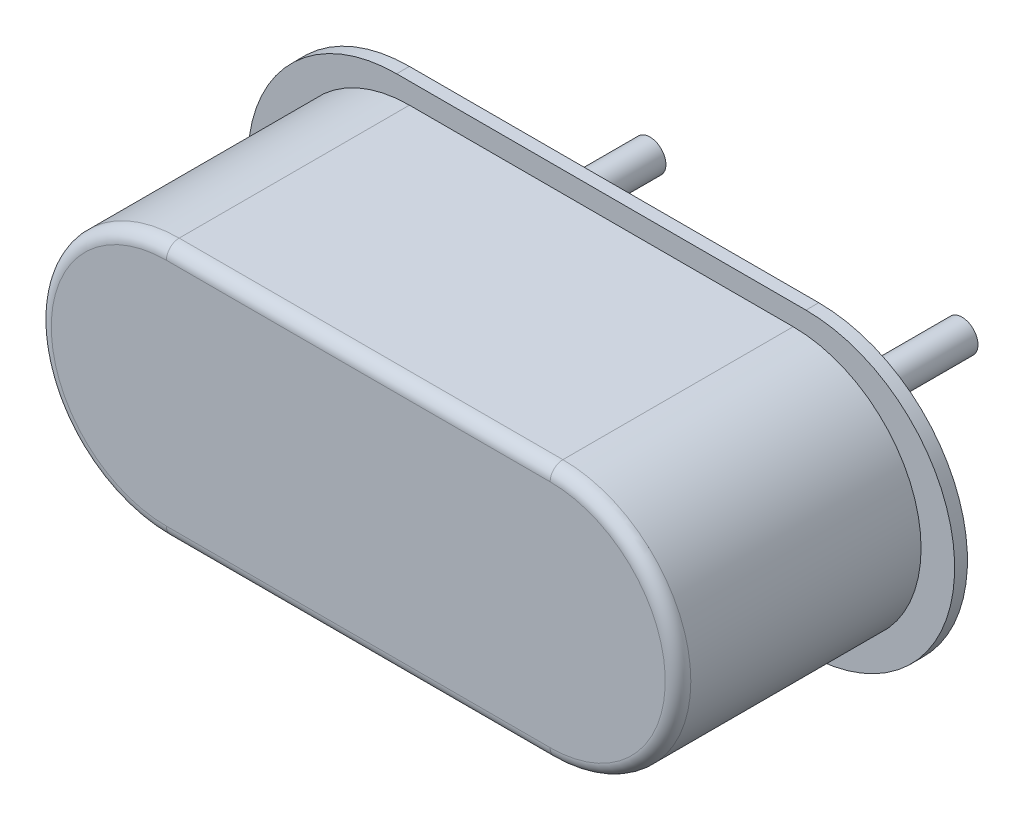
ISO-10303-21;
HEADER;
FILE_DESCRIPTION(('STEP AP214'),'2;1');
FILE_NAME('part.step','',(''),(''),'','','');
FILE_SCHEMA(('AUTOMOTIVE_DESIGN { 1 0 10303 214 1 1 1 1 }'));
ENDSEC;
DATA;
#1=APPLICATION_CONTEXT('core data for automotive mechanical design processes');
#2=APPLICATION_PROTOCOL_DEFINITION('international standard','automotive_design',2000,#1);
#3=PRODUCT_CONTEXT('',#1,'mechanical');
#4=PRODUCT('Part','Part','',(#3));
#5=PRODUCT_RELATED_PRODUCT_CATEGORY('part','',(#4));
#6=PRODUCT_DEFINITION_FORMATION('','',#4);
#7=PRODUCT_DEFINITION_CONTEXT('part definition',#1,'design');
#8=PRODUCT_DEFINITION('design','',#6,#7);
#9=PRODUCT_DEFINITION_SHAPE('','',#8);
#10=(LENGTH_UNIT() NAMED_UNIT(*) SI_UNIT(.MILLI.,.METRE.));
#11=(NAMED_UNIT(*) PLANE_ANGLE_UNIT() SI_UNIT($,.RADIAN.));
#12=(NAMED_UNIT(*) SI_UNIT($,.STERADIAN.) SOLID_ANGLE_UNIT());
#13=UNCERTAINTY_MEASURE_WITH_UNIT(LENGTH_MEASURE(1.E-05),#10,'distance_accuracy_value','');
#14=(GEOMETRIC_REPRESENTATION_CONTEXT(3) GLOBAL_UNCERTAINTY_ASSIGNED_CONTEXT((#13)) GLOBAL_UNIT_ASSIGNED_CONTEXT((#10,
#11,#12)) REPRESENTATION_CONTEXT('',''));
#15=CARTESIAN_POINT('',(0.,0.,0.));
#16=DIRECTION('',(0.,0.,1.));
#17=DIRECTION('',(1.,0.,0.));
#18=AXIS2_PLACEMENT_3D('',#15,#16,#17);
#19=CARTESIAN_POINT('',(-0.56,2.,4.1));
#20=DIRECTION('',(0.,0.,1.));
#21=DIRECTION('',(1.,0.,0.));
#22=AXIS2_PLACEMENT_3D('',#19,#20,#21);
#23=PLANE('',#22);
#24=DIRECTION('',(1.,0.,0.));
#25=VECTOR('',#24,1.);
#26=CARTESIAN_POINT('',(-0.56,1.8,4.1));
#27=LINE('',#26,#25);
#28=CARTESIAN_POINT('',(-0.56,1.8,4.1));
#29=VERTEX_POINT('',#28);
#30=CARTESIAN_POINT('',(5.44,1.8,4.1));
#31=VERTEX_POINT('',#30);
#32=EDGE_CURVE('E27',#29,#31,#27,.T.);
#33=ORIENTED_EDGE('',*,*,#32,.F.);
#34=CARTESIAN_POINT('',(-0.56,0.,4.1));
#35=DIRECTION('',(0.,0.,-1.));
#36=DIRECTION('',(-1.,0.,0.));
#37=AXIS2_PLACEMENT_3D('',#34,#35,#36);
#38=CIRCLE('',#37,1.8);
#39=CARTESIAN_POINT('',(-0.56,-1.8,4.1));
#40=VERTEX_POINT('',#39);
#41=EDGE_CURVE('E11',#40,#29,#38,.T.);
#42=ORIENTED_EDGE('',*,*,#41,.F.);
#43=DIRECTION('',(-1.,0.,0.));
#44=VECTOR('',#43,1.);
#45=CARTESIAN_POINT('',(5.44,-1.8,4.1));
#46=LINE('',#45,#44);
#47=CARTESIAN_POINT('',(5.44,-1.8,4.1));
#48=VERTEX_POINT('',#47);
#49=EDGE_CURVE('E58',#48,#40,#46,.T.);
#50=ORIENTED_EDGE('',*,*,#49,.F.);
#51=CARTESIAN_POINT('',(5.44,0.,4.1));
#52=DIRECTION('',(0.,0.,-1.));
#53=DIRECTION('',(1.,0.,0.));
#54=AXIS2_PLACEMENT_3D('',#51,#52,#53);
#55=CIRCLE('',#54,1.8);
#56=EDGE_CURVE('E72',#31,#48,#55,.T.);
#57=ORIENTED_EDGE('',*,*,#56,.F.);
#58=EDGE_LOOP('',(#33,#42,#50,#57));
#59=FACE_BOUND('',#58,.T.);
#60=ADVANCED_FACE('F17',(#59),#23,.T.);
#61=CARTESIAN_POINT('',(5.13,0.,-2.9));
#62=DIRECTION('',(0.,0.,-1.));
#63=DIRECTION('',(0.,-1.,0.));
#64=AXIS2_PLACEMENT_3D('',#61,#62,#63);
#65=PLANE('',#64);
#66=CARTESIAN_POINT('',(4.88,0.,-2.9));
#67=DIRECTION('',(0.,0.,1.));
#68=DIRECTION('',(1.,0.,0.));
#69=AXIS2_PLACEMENT_3D('',#66,#67,#68);
#70=CIRCLE('',#69,0.25);
#71=CARTESIAN_POINT('',(5.13,0.,-2.9));
#72=VERTEX_POINT('',#71);
#73=EDGE_CURVE('E83',#72,#72,#70,.T.);
#74=ORIENTED_EDGE('',*,*,#73,.F.);
#75=EDGE_LOOP('',(#74));
#76=FACE_BOUND('',#75,.T.);
#77=ADVANCED_FACE('F439',(#76),#65,.T.);
#78=CARTESIAN_POINT('',(0.25,0.,-2.9));
#79=DIRECTION('',(0.,0.,-1.));
#80=DIRECTION('',(0.,-1.,0.));
#81=AXIS2_PLACEMENT_3D('',#78,#79,#80);
#82=PLANE('',#81);
#83=CARTESIAN_POINT('',(0.,0.,-2.9));
#84=DIRECTION('',(0.,0.,1.));
#85=DIRECTION('',(1.,0.,0.));
#86=AXIS2_PLACEMENT_3D('',#83,#84,#85);
#87=CIRCLE('',#86,0.25);
#88=CARTESIAN_POINT('',(0.25,0.,-2.9));
#89=VERTEX_POINT('',#88);
#90=EDGE_CURVE('E144',#89,#89,#87,.T.);
#91=ORIENTED_EDGE('',*,*,#90,.F.);
#92=EDGE_LOOP('',(#91));
#93=FACE_BOUND('',#92,.T.);
#94=ADVANCED_FACE('F387',(#93),#82,.T.);
#95=CARTESIAN_POINT('',(-0.56,0.,3.9));
#96=DIRECTION('',(0.,0.,1.));
#97=DIRECTION('',(-1.,0.,0.));
#98=AXIS2_PLACEMENT_3D('',#95,#96,#97);
#99=TOROIDAL_SURFACE('',#98,1.8,0.2);
#100=ORIENTED_EDGE('',*,*,#41,.T.);
#101=CARTESIAN_POINT('',(-0.56,1.8,3.9));
#102=DIRECTION('',(1.,0.,0.));
#103=DIRECTION('',(0.,1.,0.));
#104=AXIS2_PLACEMENT_3D('',#101,#102,#103);
#105=CIRCLE('',#104,0.2);
#106=CARTESIAN_POINT('',(-0.56,2.,3.9));
#107=VERTEX_POINT('',#106);
#108=EDGE_CURVE('E153',#107,#29,#105,.T.);
#109=ORIENTED_EDGE('',*,*,#108,.F.);
#110=CARTESIAN_POINT('',(-0.56,0.,3.9));
#111=DIRECTION('',(0.,0.,-1.));
#112=DIRECTION('',(-1.,0.,0.));
#113=AXIS2_PLACEMENT_3D('',#110,#111,#112);
#114=CIRCLE('',#113,2.);
#115=CARTESIAN_POINT('',(-0.56,-2.,3.9));
#116=VERTEX_POINT('',#115);
#117=EDGE_CURVE('E67',#116,#107,#114,.T.);
#118=ORIENTED_EDGE('',*,*,#117,.F.);
#119=CARTESIAN_POINT('',(-0.56,-1.8,3.9));
#120=DIRECTION('',(-1.,0.,0.));
#121=DIRECTION('',(0.,-1.,0.));
#122=AXIS2_PLACEMENT_3D('',#119,#120,#121);
#123=CIRCLE('',#122,0.2);
#124=EDGE_CURVE('E66',#116,#40,#123,.T.);
#125=ORIENTED_EDGE('',*,*,#124,.T.);
#126=EDGE_LOOP('',(#100,#109,#118,#125));
#127=FACE_BOUND('',#126,.T.);
#128=ADVANCED_FACE('F70',(#127),#99,.T.);
#129=CARTESIAN_POINT('',(-0.56,1.8,3.9));
#130=DIRECTION('',(1.,0.,0.));
#131=DIRECTION('',(0.,1.,0.));
#132=AXIS2_PLACEMENT_3D('',#129,#130,#131);
#133=CYLINDRICAL_SURFACE('',#132,0.2);
#134=ORIENTED_EDGE('',*,*,#108,.T.);
#135=ORIENTED_EDGE('',*,*,#32,.T.);
#136=CARTESIAN_POINT('',(5.44,1.8,3.9));
#137=DIRECTION('',(1.,0.,0.));
#138=DIRECTION('',(0.,1.,0.));
#139=AXIS2_PLACEMENT_3D('',#136,#137,#138);
#140=CIRCLE('',#139,0.2);
#141=CARTESIAN_POINT('',(5.44,2.,3.9));
#142=VERTEX_POINT('',#141);
#143=EDGE_CURVE('E149',#142,#31,#140,.T.);
#144=ORIENTED_EDGE('',*,*,#143,.F.);
#145=DIRECTION('',(1.,0.,0.));
#146=VECTOR('',#145,1.);
#147=CARTESIAN_POINT('',(-0.56,2.,3.9));
#148=LINE('',#147,#146);
#149=EDGE_CURVE('E142',#107,#142,#148,.T.);
#150=ORIENTED_EDGE('',*,*,#149,.F.);
#151=EDGE_LOOP('',(#134,#135,#144,#150));
#152=FACE_BOUND('',#151,.T.);
#153=ADVANCED_FACE('F159',(#152),#133,.T.);
#154=CARTESIAN_POINT('',(5.44,0.,3.9));
#155=DIRECTION('',(0.,0.,1.));
#156=DIRECTION('',(1.,0.,0.));
#157=AXIS2_PLACEMENT_3D('',#154,#155,#156);
#158=TOROIDAL_SURFACE('',#157,1.8,0.2);
#159=ORIENTED_EDGE('',*,*,#56,.T.);
#160=CARTESIAN_POINT('',(5.44,-1.8,3.9));
#161=DIRECTION('',(-1.,-1.037331781055E-13,0.));
#162=DIRECTION('',(1.037331781055E-13,-1.,0.));
#163=AXIS2_PLACEMENT_3D('',#160,#161,#162);
#164=CIRCLE('',#163,0.2);
#165=CARTESIAN_POINT('',(5.44,-2.,3.9));
#166=VERTEX_POINT('',#165);
#167=EDGE_CURVE('E77',#166,#48,#164,.T.);
#168=ORIENTED_EDGE('',*,*,#167,.F.);
#169=CARTESIAN_POINT('',(5.44,0.,3.9));
#170=DIRECTION('',(0.,0.,-1.));
#171=DIRECTION('',(1.,0.,0.));
#172=AXIS2_PLACEMENT_3D('',#169,#170,#171);
#173=CIRCLE('',#172,2.);
#174=EDGE_CURVE('E132',#142,#166,#173,.T.);
#175=ORIENTED_EDGE('',*,*,#174,.F.);
#176=ORIENTED_EDGE('',*,*,#143,.T.);
#177=EDGE_LOOP('',(#159,#168,#175,#176));
#178=FACE_BOUND('',#177,.T.);
#179=ADVANCED_FACE('F163',(#178),#158,.T.);
#180=CARTESIAN_POINT('',(5.44,-1.8,3.9));
#181=DIRECTION('',(-1.,0.,0.));
#182=DIRECTION('',(0.,-1.,0.));
#183=AXIS2_PLACEMENT_3D('',#180,#181,#182);
#184=CYLINDRICAL_SURFACE('',#183,0.2);
#185=ORIENTED_EDGE('',*,*,#167,.T.);
#186=ORIENTED_EDGE('',*,*,#49,.T.);
#187=ORIENTED_EDGE('',*,*,#124,.F.);
#188=DIRECTION('',(-1.,0.,0.));
#189=VECTOR('',#188,1.);
#190=CARTESIAN_POINT('',(5.44,-2.,3.9));
#191=LINE('',#190,#189);
#192=EDGE_CURVE('E130',#166,#116,#191,.T.);
#193=ORIENTED_EDGE('',*,*,#192,.F.);
#194=EDGE_LOOP('',(#185,#186,#187,#193));
#195=FACE_BOUND('',#194,.T.);
#196=ADVANCED_FACE('F76',(#195),#184,.T.);
#197=CARTESIAN_POINT('',(4.88,0.,0.1));
#198=DIRECTION('',(0.,0.,1.));
#199=DIRECTION('',(1.,0.,0.));
#200=AXIS2_PLACEMENT_3D('',#197,#198,#199);
#201=CYLINDRICAL_SURFACE('',#200,0.25);
#202=ORIENTED_EDGE('',*,*,#73,.T.);
#203=EDGE_LOOP('',(#202));
#204=FACE_BOUND('',#203,.T.);
#205=CARTESIAN_POINT('',(4.88,0.,0.1));
#206=DIRECTION('',(0.,0.,1.));
#207=DIRECTION('',(1.,0.,0.));
#208=AXIS2_PLACEMENT_3D('',#205,#206,#207);
#209=CIRCLE('',#208,0.25);
#210=CARTESIAN_POINT('',(5.13,0.,0.1));
#211=VERTEX_POINT('',#210);
#212=EDGE_CURVE('E119',#211,#211,#209,.T.);
#213=ORIENTED_EDGE('',*,*,#212,.F.);
#214=EDGE_LOOP('',(#213));
#215=FACE_BOUND('',#214,.T.);
#216=ADVANCED_FACE('F462',(#204,#215),#201,.T.);
#217=CARTESIAN_POINT('',(0.,0.,0.1));
#218=DIRECTION('',(0.,0.,1.));
#219=DIRECTION('',(1.,0.,0.));
#220=AXIS2_PLACEMENT_3D('',#217,#218,#219);
#221=CYLINDRICAL_SURFACE('',#220,0.25);
#222=ORIENTED_EDGE('',*,*,#90,.T.);
#223=EDGE_LOOP('',(#222));
#224=FACE_BOUND('',#223,.T.);
#225=CARTESIAN_POINT('',(0.,0.,0.1));
#226=DIRECTION('',(0.,0.,1.));
#227=DIRECTION('',(1.,0.,0.));
#228=AXIS2_PLACEMENT_3D('',#225,#226,#227);
#229=CIRCLE('',#228,0.25);
#230=CARTESIAN_POINT('',(0.25,0.,0.1));
#231=VERTEX_POINT('',#230);
#232=EDGE_CURVE('E111',#231,#231,#229,.T.);
#233=ORIENTED_EDGE('',*,*,#232,.F.);
#234=EDGE_LOOP('',(#233));
#235=FACE_BOUND('',#234,.T.);
#236=ADVANCED_FACE('F359',(#224,#235),#221,.T.);
#237=CARTESIAN_POINT('',(-0.56,0.,0.1));
#238=DIRECTION('',(0.,0.,-1.));
#239=DIRECTION('',(1.,0.,0.));
#240=AXIS2_PLACEMENT_3D('',#237,#238,#239);
#241=CYLINDRICAL_SURFACE('',#240,2.);
#242=DIRECTION('',(0.,0.,1.));
#243=VECTOR('',#242,1.);
#244=CARTESIAN_POINT('',(-0.56,2.,0.1));
#245=LINE('',#244,#243);
#246=CARTESIAN_POINT('',(-0.56,2.,0.3));
#247=VERTEX_POINT('',#246);
#248=EDGE_CURVE('E139',#247,#107,#245,.T.);
#249=ORIENTED_EDGE('',*,*,#248,.F.);
#250=CARTESIAN_POINT('',(-0.56,0.,0.3));
#251=DIRECTION('',(0.,0.,-1.));
#252=DIRECTION('',(1.,0.,0.));
#253=AXIS2_PLACEMENT_3D('',#250,#251,#252);
#254=CIRCLE('',#253,2.);
#255=CARTESIAN_POINT('',(-0.56,-2.,0.3));
#256=VERTEX_POINT('',#255);
#257=EDGE_CURVE('E94',#256,#247,#254,.T.);
#258=ORIENTED_EDGE('',*,*,#257,.F.);
#259=DIRECTION('',(0.,0.,1.));
#260=VECTOR('',#259,1.);
#261=CARTESIAN_POINT('',(-0.56,-2.,0.1));
#262=LINE('',#261,#260);
#263=EDGE_CURVE('E129',#256,#116,#262,.T.);
#264=ORIENTED_EDGE('',*,*,#263,.T.);
#265=ORIENTED_EDGE('',*,*,#117,.T.);
#266=EDGE_LOOP('',(#249,#258,#264,#265));
#267=FACE_BOUND('',#266,.T.);
#268=ADVANCED_FACE('F355',(#267),#241,.T.);
#269=CARTESIAN_POINT('',(-0.56,2.,0.1));
#270=DIRECTION('',(0.,1.,0.));
#271=DIRECTION('',(1.,0.,0.));
#272=AXIS2_PLACEMENT_3D('',#269,#270,#271);
#273=PLANE('',#272);
#274=DIRECTION('',(-1.,0.,0.));
#275=VECTOR('',#274,1.);
#276=CARTESIAN_POINT('',(-0.66,2.,0.3));
#277=LINE('',#276,#275);
#278=CARTESIAN_POINT('',(5.44,2.,0.3));
#279=VERTEX_POINT('',#278);
#280=EDGE_CURVE('E98',#279,#247,#277,.T.);
#281=ORIENTED_EDGE('',*,*,#280,.T.);
#282=ORIENTED_EDGE('',*,*,#248,.T.);
#283=ORIENTED_EDGE('',*,*,#149,.T.);
#284=DIRECTION('',(0.,0.,1.));
#285=VECTOR('',#284,1.);
#286=CARTESIAN_POINT('',(5.44,2.,0.1));
#287=LINE('',#286,#285);
#288=EDGE_CURVE('E140',#279,#142,#287,.T.);
#289=ORIENTED_EDGE('',*,*,#288,.F.);
#290=EDGE_LOOP('',(#281,#282,#283,#289));
#291=FACE_BOUND('',#290,.T.);
#292=ADVANCED_FACE('F203',(#291),#273,.T.);
#293=CARTESIAN_POINT('',(5.44,0.,0.1));
#294=DIRECTION('',(0.,0.,-1.));
#295=DIRECTION('',(1.,0.,0.));
#296=AXIS2_PLACEMENT_3D('',#293,#294,#295);
#297=CYLINDRICAL_SURFACE('',#296,2.);
#298=DIRECTION('',(0.,0.,1.));
#299=VECTOR('',#298,1.);
#300=CARTESIAN_POINT('',(5.44,-2.,0.1));
#301=LINE('',#300,#299);
#302=CARTESIAN_POINT('',(5.44,-2.,0.3));
#303=VERTEX_POINT('',#302);
#304=EDGE_CURVE('E125',#303,#166,#301,.T.);
#305=ORIENTED_EDGE('',*,*,#304,.F.);
#306=CARTESIAN_POINT('',(5.44,0.,0.3));
#307=DIRECTION('',(0.,0.,-1.));
#308=DIRECTION('',(1.,0.,0.));
#309=AXIS2_PLACEMENT_3D('',#306,#307,#308);
#310=CIRCLE('',#309,2.);
#311=EDGE_CURVE('E105',#279,#303,#310,.T.);
#312=ORIENTED_EDGE('',*,*,#311,.F.);
#313=ORIENTED_EDGE('',*,*,#288,.T.);
#314=ORIENTED_EDGE('',*,*,#174,.T.);
#315=EDGE_LOOP('',(#305,#312,#313,#314));
#316=FACE_BOUND('',#315,.T.);
#317=ADVANCED_FACE('F166',(#316),#297,.T.);
#318=CARTESIAN_POINT('',(5.44,-2.,0.1));
#319=DIRECTION('',(0.,-1.,0.));
#320=DIRECTION('',(0.,0.,-1.));
#321=AXIS2_PLACEMENT_3D('',#318,#319,#320);
#322=PLANE('',#321);
#323=DIRECTION('',(1.,0.,0.));
#324=VECTOR('',#323,1.);
#325=CARTESIAN_POINT('',(2.34,-2.,0.3));
#326=LINE('',#325,#324);
#327=EDGE_CURVE('E93',#256,#303,#326,.T.);
#328=ORIENTED_EDGE('',*,*,#327,.T.);
#329=ORIENTED_EDGE('',*,*,#304,.T.);
#330=ORIENTED_EDGE('',*,*,#192,.T.);
#331=ORIENTED_EDGE('',*,*,#263,.F.);
#332=EDGE_LOOP('',(#328,#329,#330,#331));
#333=FACE_BOUND('',#332,.T.);
#334=ADVANCED_FACE('F180',(#333),#322,.T.);
#335=CARTESIAN_POINT('',(5.64,-2.325,0.1));
#336=DIRECTION('',(0.,-1.,0.));
#337=DIRECTION('',(0.,0.,-1.));
#338=AXIS2_PLACEMENT_3D('',#335,#336,#337);
#339=PLANE('',#338);
#340=DIRECTION('',(0.,0.,1.));
#341=VECTOR('',#340,1.);
#342=CARTESIAN_POINT('',(5.64,-2.325,0.1));
#343=LINE('',#342,#341);
#344=CARTESIAN_POINT('',(5.64,-2.325,0.1));
#345=VERTEX_POINT('',#344);
#346=CARTESIAN_POINT('',(5.64,-2.325,0.3));
#347=VERTEX_POINT('',#346);
#348=EDGE_CURVE('E109',#345,#347,#343,.T.);
#349=ORIENTED_EDGE('',*,*,#348,.T.);
#350=DIRECTION('',(-1.,0.,0.));
#351=VECTOR('',#350,1.);
#352=CARTESIAN_POINT('',(5.64,-2.325,0.3));
#353=LINE('',#352,#351);
#354=CARTESIAN_POINT('',(-0.76,-2.325,0.3));
#355=VERTEX_POINT('',#354);
#356=EDGE_CURVE('E90',#347,#355,#353,.T.);
#357=ORIENTED_EDGE('',*,*,#356,.T.);
#358=DIRECTION('',(0.,0.,1.));
#359=VECTOR('',#358,1.);
#360=CARTESIAN_POINT('',(-0.76,-2.325,0.1));
#361=LINE('',#360,#359);
#362=CARTESIAN_POINT('',(-0.76,-2.325,0.1));
#363=VERTEX_POINT('',#362);
#364=EDGE_CURVE('E106',#363,#355,#361,.T.);
#365=ORIENTED_EDGE('',*,*,#364,.F.);
#366=DIRECTION('',(-1.,0.,0.));
#367=VECTOR('',#366,1.);
#368=CARTESIAN_POINT('',(5.64,-2.325,0.1));
#369=LINE('',#368,#367);
#370=EDGE_CURVE('E239',#345,#363,#369,.T.);
#371=ORIENTED_EDGE('',*,*,#370,.F.);
#372=EDGE_LOOP('',(#349,#357,#365,#371));
#373=FACE_BOUND('',#372,.T.);
#374=ADVANCED_FACE('F499',(#373),#339,.T.);
#375=CARTESIAN_POINT('',(-0.76,2.325,0.3));
#376=DIRECTION('',(0.,0.,1.));
#377=DIRECTION('',(1.,0.,0.));
#378=AXIS2_PLACEMENT_3D('',#375,#376,#377);
#379=PLANE('',#378);
#380=ORIENTED_EDGE('',*,*,#327,.F.);
#381=ORIENTED_EDGE('',*,*,#257,.T.);
#382=ORIENTED_EDGE('',*,*,#280,.F.);
#383=ORIENTED_EDGE('',*,*,#311,.T.);
#384=EDGE_LOOP('',(#380,#381,#382,#383));
#385=FACE_BOUND('',#384,.T.);
#386=DIRECTION('',(1.,0.,0.));
#387=VECTOR('',#386,1.);
#388=CARTESIAN_POINT('',(-0.76,2.325,0.3));
#389=LINE('',#388,#387);
#390=CARTESIAN_POINT('',(-0.76,2.325,0.3));
#391=VERTEX_POINT('',#390);
#392=CARTESIAN_POINT('',(5.64,2.325,0.3));
#393=VERTEX_POINT('',#392);
#394=EDGE_CURVE('E209',#391,#393,#389,.T.);
#395=ORIENTED_EDGE('',*,*,#394,.F.);
#396=CARTESIAN_POINT('',(-0.76,0.,0.3));
#397=DIRECTION('',(0.,0.,1.));
#398=DIRECTION('',(1.,0.,0.));
#399=AXIS2_PLACEMENT_3D('',#396,#397,#398);
#400=CIRCLE('',#399,2.325);
#401=EDGE_CURVE('E226',#391,#355,#400,.T.);
#402=ORIENTED_EDGE('',*,*,#401,.T.);
#403=ORIENTED_EDGE('',*,*,#356,.F.);
#404=CARTESIAN_POINT('',(5.64,0.,0.3));
#405=DIRECTION('',(0.,0.,1.));
#406=DIRECTION('',(1.,0.,0.));
#407=AXIS2_PLACEMENT_3D('',#404,#405,#406);
#408=CIRCLE('',#407,2.325);
#409=EDGE_CURVE('E240',#347,#393,#408,.T.);
#410=ORIENTED_EDGE('',*,*,#409,.T.);
#411=EDGE_LOOP('',(#395,#402,#403,#410));
#412=FACE_BOUND('',#411,.T.);
#413=ADVANCED_FACE('F184',(#385,#412),#379,.T.);
#414=CARTESIAN_POINT('',(-0.76,2.325,0.1));
#415=DIRECTION('',(0.,0.,1.));
#416=DIRECTION('',(1.,0.,0.));
#417=AXIS2_PLACEMENT_3D('',#414,#415,#416);
#418=PLANE('',#417);
#419=CARTESIAN_POINT('',(5.64,0.,0.1));
#420=DIRECTION('',(0.,0.,1.));
#421=DIRECTION('',(1.,0.,0.));
#422=AXIS2_PLACEMENT_3D('',#419,#420,#421);
#423=CIRCLE('',#422,2.325);
#424=CARTESIAN_POINT('',(5.64,2.325,0.1));
#425=VERTEX_POINT('',#424);
#426=EDGE_CURVE('E235',#345,#425,#423,.T.);
#427=ORIENTED_EDGE('',*,*,#426,.F.);
#428=ORIENTED_EDGE('',*,*,#370,.T.);
#429=CARTESIAN_POINT('',(-0.76,0.,0.1));
#430=DIRECTION('',(0.,0.,1.));
#431=DIRECTION('',(1.,0.,0.));
#432=AXIS2_PLACEMENT_3D('',#429,#430,#431);
#433=CIRCLE('',#432,2.325);
#434=CARTESIAN_POINT('',(-0.76,2.325,0.1));
#435=VERTEX_POINT('',#434);
#436=EDGE_CURVE('E225',#435,#363,#433,.T.);
#437=ORIENTED_EDGE('',*,*,#436,.F.);
#438=DIRECTION('',(1.,0.,0.));
#439=VECTOR('',#438,1.);
#440=CARTESIAN_POINT('',(-0.76,2.325,0.1));
#441=LINE('',#440,#439);
#442=EDGE_CURVE('E217',#435,#425,#441,.T.);
#443=ORIENTED_EDGE('',*,*,#442,.T.);
#444=EDGE_LOOP('',(#427,#428,#437,#443));
#445=FACE_BOUND('',#444,.T.);
#446=ORIENTED_EDGE('',*,*,#212,.T.);
#447=EDGE_LOOP('',(#446));
#448=FACE_BOUND('',#447,.T.);
#449=ORIENTED_EDGE('',*,*,#232,.T.);
#450=EDGE_LOOP('',(#449));
#451=FACE_BOUND('',#450,.T.);
#452=ADVANCED_FACE('F319',(#445,#448,#451),#418,.F.);
#453=CARTESIAN_POINT('',(5.64,0.,0.1));
#454=DIRECTION('',(0.,0.,-1.));
#455=DIRECTION('',(1.,0.,0.));
#456=AXIS2_PLACEMENT_3D('',#453,#454,#455);
#457=CYLINDRICAL_SURFACE('',#456,2.325);
#458=ORIENTED_EDGE('',*,*,#426,.T.);
#459=DIRECTION('',(0.,0.,1.));
#460=VECTOR('',#459,1.);
#461=CARTESIAN_POINT('',(5.64,2.325,0.1));
#462=LINE('',#461,#460);
#463=EDGE_CURVE('E213',#425,#393,#462,.T.);
#464=ORIENTED_EDGE('',*,*,#463,.T.);
#465=ORIENTED_EDGE('',*,*,#409,.F.);
#466=ORIENTED_EDGE('',*,*,#348,.F.);
#467=EDGE_LOOP('',(#458,#464,#465,#466));
#468=FACE_BOUND('',#467,.T.);
#469=ADVANCED_FACE('F301',(#468),#457,.T.);
#470=CARTESIAN_POINT('',(-0.76,0.,0.1));
#471=DIRECTION('',(0.,0.,-1.));
#472=DIRECTION('',(1.,0.,0.));
#473=AXIS2_PLACEMENT_3D('',#470,#471,#472);
#474=CYLINDRICAL_SURFACE('',#473,2.325);
#475=ORIENTED_EDGE('',*,*,#436,.T.);
#476=ORIENTED_EDGE('',*,*,#364,.T.);
#477=ORIENTED_EDGE('',*,*,#401,.F.);
#478=DIRECTION('',(0.,0.,1.));
#479=VECTOR('',#478,1.);
#480=CARTESIAN_POINT('',(-0.76,2.325,0.1));
#481=LINE('',#480,#479);
#482=EDGE_CURVE('E212',#435,#391,#481,.T.);
#483=ORIENTED_EDGE('',*,*,#482,.F.);
#484=EDGE_LOOP('',(#475,#476,#477,#483));
#485=FACE_BOUND('',#484,.T.);
#486=ADVANCED_FACE('F300',(#485),#474,.T.);
#487=CARTESIAN_POINT('',(-0.76,2.325,0.1));
#488=DIRECTION('',(0.,1.,0.));
#489=DIRECTION('',(1.,0.,0.));
#490=AXIS2_PLACEMENT_3D('',#487,#488,#489);
#491=PLANE('',#490);
#492=ORIENTED_EDGE('',*,*,#482,.T.);
#493=ORIENTED_EDGE('',*,*,#394,.T.);
#494=ORIENTED_EDGE('',*,*,#463,.F.);
#495=ORIENTED_EDGE('',*,*,#442,.F.);
#496=EDGE_LOOP('',(#492,#493,#494,#495));
#497=FACE_BOUND('',#496,.T.);
#498=ADVANCED_FACE('F304',(#497),#491,.T.);
#499=CLOSED_SHELL('',(#60,#77,#94,#128,#153,#179,#196,#216,#236,#268,#292,#317,#334,#374,#413,
#452,#469,#486,#498));
#500=MANIFOLD_SOLID_BREP('B1',#499);
#501=ADVANCED_BREP_SHAPE_REPRESENTATION('',(#18,#500),#14);
#502=SHAPE_DEFINITION_REPRESENTATION(#9,#501);
ENDSEC;
END-ISO-10303-21;
